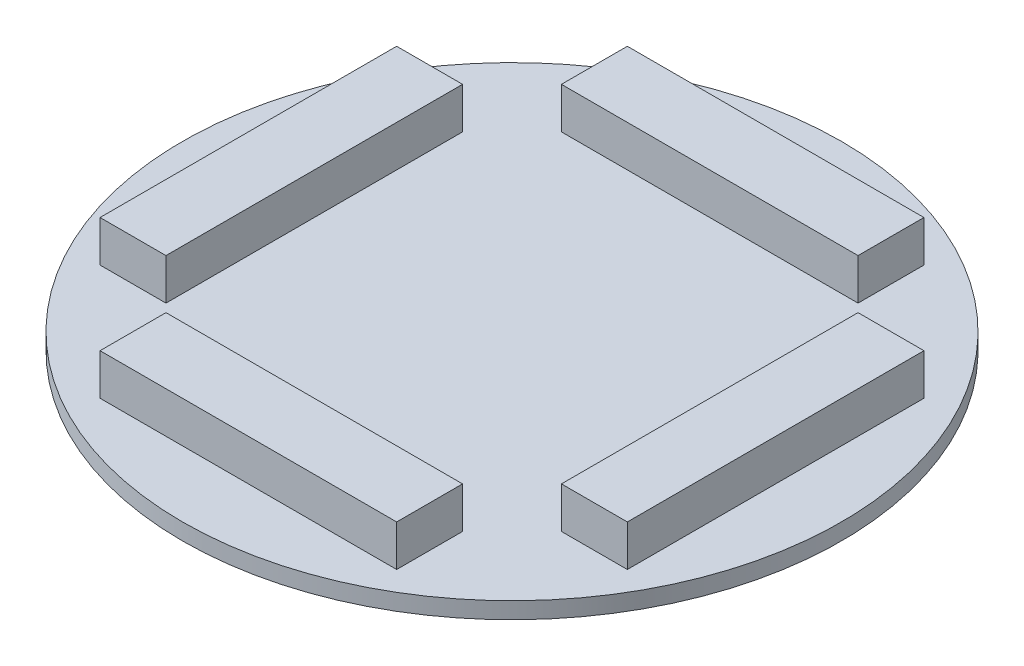
ISO-10303-21;
HEADER;
FILE_DESCRIPTION(('STEP AP214'),'2;1');
FILE_NAME('part.step','',(''),(''),'','','');
FILE_SCHEMA(('AUTOMOTIVE_DESIGN { 1 0 10303 214 1 1 1 1 }'));
ENDSEC;
DATA;
#1=APPLICATION_CONTEXT('core data for automotive mechanical design processes');
#2=APPLICATION_PROTOCOL_DEFINITION('international standard','automotive_design',2000,#1);
#3=PRODUCT_CONTEXT('',#1,'mechanical');
#4=PRODUCT('Part','Part','',(#3));
#5=PRODUCT_RELATED_PRODUCT_CATEGORY('part','',(#4));
#6=PRODUCT_DEFINITION_FORMATION('','',#4);
#7=PRODUCT_DEFINITION_CONTEXT('part definition',#1,'design');
#8=PRODUCT_DEFINITION('design','',#6,#7);
#9=PRODUCT_DEFINITION_SHAPE('','',#8);
#10=(LENGTH_UNIT() NAMED_UNIT(*) SI_UNIT(.MILLI.,.METRE.));
#11=(NAMED_UNIT(*) PLANE_ANGLE_UNIT() SI_UNIT($,.RADIAN.));
#12=(NAMED_UNIT(*) SI_UNIT($,.STERADIAN.) SOLID_ANGLE_UNIT());
#13=UNCERTAINTY_MEASURE_WITH_UNIT(LENGTH_MEASURE(1.E-05),#10,'distance_accuracy_value','');
#14=(GEOMETRIC_REPRESENTATION_CONTEXT(3) GLOBAL_UNCERTAINTY_ASSIGNED_CONTEXT((#13)) GLOBAL_UNIT_ASSIGNED_CONTEXT((#10,
#11,#12)) REPRESENTATION_CONTEXT('',''));
#15=CARTESIAN_POINT('',(0.,0.,0.));
#16=DIRECTION('',(0.,0.,1.));
#17=DIRECTION('',(1.,0.,0.));
#18=AXIS2_PLACEMENT_3D('',#15,#16,#17);
#19=CARTESIAN_POINT('',(0.,1.,0.));
#20=DIRECTION('',(0.,1.,0.));
#21=DIRECTION('',(0.,0.,1.));
#22=AXIS2_PLACEMENT_3D('',#19,#20,#21);
#23=PLANE('',#22);
#24=CARTESIAN_POINT('',(0.,1.,0.));
#25=DIRECTION('',(0.,1.,0.));
#26=DIRECTION('',(0.,0.,1.));
#27=AXIS2_PLACEMENT_3D('',#24,#25,#26);
#28=CIRCLE('',#27,20.);
#29=CARTESIAN_POINT('',(0.,1.,20.));
#30=VERTEX_POINT('',#29);
#31=EDGE_CURVE('E11',#30,#30,#28,.T.);
#32=ORIENTED_EDGE('',*,*,#31,.T.);
#33=EDGE_LOOP('',(#32));
#34=FACE_BOUND('',#33,.T.);
#35=DIRECTION('',(1.,0.,0.));
#36=VECTOR('',#35,1.);
#37=CARTESIAN_POINT('',(-9.,1.,-12.));
#38=LINE('',#37,#36);
#39=CARTESIAN_POINT('',(-9.,1.,-12.));
#40=VERTEX_POINT('',#39);
#41=CARTESIAN_POINT('',(9.,1.,-12.));
#42=VERTEX_POINT('',#41);
#43=EDGE_CURVE('E257',#40,#42,#38,.T.);
#44=ORIENTED_EDGE('',*,*,#43,.F.);
#45=DIRECTION('',(0.,0.,1.));
#46=VECTOR('',#45,1.);
#47=CARTESIAN_POINT('',(-9.,1.,-16.));
#48=LINE('',#47,#46);
#49=CARTESIAN_POINT('',(-9.,1.,-16.));
#50=VERTEX_POINT('',#49);
#51=EDGE_CURVE('E241',#50,#40,#48,.T.);
#52=ORIENTED_EDGE('',*,*,#51,.F.);
#53=DIRECTION('',(1.,0.,0.));
#54=VECTOR('',#53,1.);
#55=CARTESIAN_POINT('',(-9.,1.,-16.));
#56=LINE('',#55,#54);
#57=CARTESIAN_POINT('',(9.,1.,-16.));
#58=VERTEX_POINT('',#57);
#59=EDGE_CURVE('E246',#50,#58,#56,.T.);
#60=ORIENTED_EDGE('',*,*,#59,.T.);
#61=DIRECTION('',(0.,0.,1.));
#62=VECTOR('',#61,1.);
#63=CARTESIAN_POINT('',(9.,1.,-16.));
#64=LINE('',#63,#62);
#65=EDGE_CURVE('E260',#58,#42,#64,.T.);
#66=ORIENTED_EDGE('',*,*,#65,.T.);
#67=EDGE_LOOP('',(#44,#52,#60,#66));
#68=FACE_BOUND('',#67,.T.);
#69=DIRECTION('',(0.,0.,-1.));
#70=VECTOR('',#69,1.);
#71=CARTESIAN_POINT('',(-12.,1.,9.00000000000004));
#72=LINE('',#71,#70);
#73=CARTESIAN_POINT('',(-12.,1.,9.00000000000004));
#74=VERTEX_POINT('',#73);
#75=CARTESIAN_POINT('',(-12.,1.,-8.99999999999996));
#76=VERTEX_POINT('',#75);
#77=EDGE_CURVE('E224',#74,#76,#72,.T.);
#78=ORIENTED_EDGE('',*,*,#77,.F.);
#79=DIRECTION('',(1.,0.,0.));
#80=VECTOR('',#79,1.);
#81=CARTESIAN_POINT('',(-16.,1.,9.00000000000006));
#82=LINE('',#81,#80);
#83=CARTESIAN_POINT('',(-16.,1.,9.00000000000006));
#84=VERTEX_POINT('',#83);
#85=EDGE_CURVE('E208',#84,#74,#82,.T.);
#86=ORIENTED_EDGE('',*,*,#85,.F.);
#87=DIRECTION('',(0.,0.,-1.));
#88=VECTOR('',#87,1.);
#89=CARTESIAN_POINT('',(-16.,1.,9.00000000000006));
#90=LINE('',#89,#88);
#91=CARTESIAN_POINT('',(-16.,1.,-8.99999999999994));
#92=VERTEX_POINT('',#91);
#93=EDGE_CURVE('E213',#84,#92,#90,.T.);
#94=ORIENTED_EDGE('',*,*,#93,.T.);
#95=DIRECTION('',(1.,0.,0.));
#96=VECTOR('',#95,1.);
#97=CARTESIAN_POINT('',(-16.,1.,-8.99999999999994));
#98=LINE('',#97,#96);
#99=EDGE_CURVE('E227',#92,#76,#98,.T.);
#100=ORIENTED_EDGE('',*,*,#99,.T.);
#101=EDGE_LOOP('',(#78,#86,#94,#100));
#102=FACE_BOUND('',#101,.T.);
#103=DIRECTION('',(-1.,0.,0.));
#104=VECTOR('',#103,1.);
#105=CARTESIAN_POINT('',(9.,1.,12.));
#106=LINE('',#105,#104);
#107=CARTESIAN_POINT('',(9.,1.,12.));
#108=VERTEX_POINT('',#107);
#109=CARTESIAN_POINT('',(-9.,1.,12.));
#110=VERTEX_POINT('',#109);
#111=EDGE_CURVE('E173',#108,#110,#106,.T.);
#112=ORIENTED_EDGE('',*,*,#111,.F.);
#113=DIRECTION('',(0.,0.,-1.));
#114=VECTOR('',#113,1.);
#115=CARTESIAN_POINT('',(9.,1.,16.));
#116=LINE('',#115,#114);
#117=CARTESIAN_POINT('',(9.,1.,16.));
#118=VERTEX_POINT('',#117);
#119=EDGE_CURVE('E170',#118,#108,#116,.T.);
#120=ORIENTED_EDGE('',*,*,#119,.F.);
#121=DIRECTION('',(-1.,0.,0.));
#122=VECTOR('',#121,1.);
#123=CARTESIAN_POINT('',(9.,1.,16.));
#124=LINE('',#123,#122);
#125=CARTESIAN_POINT('',(-9.,1.,16.));
#126=VERTEX_POINT('',#125);
#127=EDGE_CURVE('E183',#118,#126,#124,.T.);
#128=ORIENTED_EDGE('',*,*,#127,.T.);
#129=DIRECTION('',(0.,0.,-1.));
#130=VECTOR('',#129,1.);
#131=CARTESIAN_POINT('',(-9.,1.,16.));
#132=LINE('',#131,#130);
#133=EDGE_CURVE('E194',#126,#110,#132,.T.);
#134=ORIENTED_EDGE('',*,*,#133,.T.);
#135=EDGE_LOOP('',(#112,#120,#128,#134));
#136=FACE_BOUND('',#135,.T.);
#137=DIRECTION('',(0.,0.,1.));
#138=VECTOR('',#137,1.);
#139=CARTESIAN_POINT('',(11.9999999999999,1.,-9.00000000000012));
#140=LINE('',#139,#138);
#141=CARTESIAN_POINT('',(11.9999999999999,1.,-9.00000000000012));
#142=VERTEX_POINT('',#141);
#143=CARTESIAN_POINT('',(12.0000000000001,1.,8.99999999999988));
#144=VERTEX_POINT('',#143);
#145=EDGE_CURVE('E50',#142,#144,#140,.T.);
#146=ORIENTED_EDGE('',*,*,#145,.F.);
#147=DIRECTION('',(-1.,0.,0.));
#148=VECTOR('',#147,1.);
#149=CARTESIAN_POINT('',(15.9999999999999,1.,-9.00000000000017));
#150=LINE('',#149,#148);
#151=CARTESIAN_POINT('',(15.9999999999999,1.,-9.00000000000017));
#152=VERTEX_POINT('',#151);
#153=EDGE_CURVE('E169',#152,#142,#150,.T.);
#154=ORIENTED_EDGE('',*,*,#153,.F.);
#155=DIRECTION('',(0.,0.,1.));
#156=VECTOR('',#155,1.);
#157=CARTESIAN_POINT('',(15.9999999999999,1.,-9.00000000000017));
#158=LINE('',#157,#156);
#159=CARTESIAN_POINT('',(16.0000000000001,1.,8.99999999999983));
#160=VERTEX_POINT('',#159);
#161=EDGE_CURVE('E166',#152,#160,#158,.T.);
#162=ORIENTED_EDGE('',*,*,#161,.T.);
#163=DIRECTION('',(-1.,0.,0.));
#164=VECTOR('',#163,1.);
#165=CARTESIAN_POINT('',(16.0000000000001,1.,8.99999999999983));
#166=LINE('',#165,#164);
#167=EDGE_CURVE('E55',#160,#144,#166,.T.);
#168=ORIENTED_EDGE('',*,*,#167,.T.);
#169=EDGE_LOOP('',(#146,#154,#162,#168));
#170=FACE_BOUND('',#169,.T.);
#171=ADVANCED_FACE('F35',(#34,#68,#102,#136,#170),#23,.T.);
#172=CARTESIAN_POINT('',(0.,1.,0.));
#173=DIRECTION('',(0.,-1.,0.));
#174=DIRECTION('',(0.,0.,-1.));
#175=AXIS2_PLACEMENT_3D('',#172,#173,#174);
#176=CYLINDRICAL_SURFACE('',#175,20.);
#177=ORIENTED_EDGE('',*,*,#31,.F.);
#178=EDGE_LOOP('',(#177));
#179=FACE_BOUND('',#178,.T.);
#180=CARTESIAN_POINT('',(0.,0.,0.));
#181=DIRECTION('',(0.,1.,0.));
#182=DIRECTION('',(0.,0.,1.));
#183=AXIS2_PLACEMENT_3D('',#180,#181,#182);
#184=CIRCLE('',#183,20.);
#185=CARTESIAN_POINT('',(0.,0.,20.));
#186=VERTEX_POINT('',#185);
#187=EDGE_CURVE('E39',#186,#186,#184,.T.);
#188=ORIENTED_EDGE('',*,*,#187,.T.);
#189=EDGE_LOOP('',(#188));
#190=FACE_BOUND('',#189,.T.);
#191=ADVANCED_FACE('F37',(#179,#190),#176,.T.);
#192=CARTESIAN_POINT('',(0.,0.,0.));
#193=DIRECTION('',(0.,1.,0.));
#194=DIRECTION('',(0.,0.,1.));
#195=AXIS2_PLACEMENT_3D('',#192,#193,#194);
#196=PLANE('',#195);
#197=ORIENTED_EDGE('',*,*,#187,.F.);
#198=EDGE_LOOP('',(#197));
#199=FACE_BOUND('',#198,.T.);
#200=ADVANCED_FACE('F279',(#199),#196,.F.);
#201=CARTESIAN_POINT('',(-9.,3.5,-16.));
#202=DIRECTION('',(1.,0.,0.));
#203=DIRECTION('',(0.,0.,-1.));
#204=AXIS2_PLACEMENT_3D('',#201,#202,#203);
#205=PLANE('',#204);
#206=ORIENTED_EDGE('',*,*,#51,.T.);
#207=DIRECTION('',(0.,-1.,0.));
#208=VECTOR('',#207,1.);
#209=CARTESIAN_POINT('',(-9.,3.5,-12.));
#210=LINE('',#209,#208);
#211=CARTESIAN_POINT('',(-9.,3.5,-12.));
#212=VERTEX_POINT('',#211);
#213=EDGE_CURVE('E271',#212,#40,#210,.T.);
#214=ORIENTED_EDGE('',*,*,#213,.F.);
#215=DIRECTION('',(0.,0.,1.));
#216=VECTOR('',#215,1.);
#217=CARTESIAN_POINT('',(-9.,3.5,-16.));
#218=LINE('',#217,#216);
#219=CARTESIAN_POINT('',(-9.,3.5,-16.));
#220=VERTEX_POINT('',#219);
#221=EDGE_CURVE('E242',#220,#212,#218,.T.);
#222=ORIENTED_EDGE('',*,*,#221,.F.);
#223=DIRECTION('',(0.,-1.,0.));
#224=VECTOR('',#223,1.);
#225=CARTESIAN_POINT('',(-9.,3.5,-16.));
#226=LINE('',#225,#224);
#227=EDGE_CURVE('E254',#220,#50,#226,.T.);
#228=ORIENTED_EDGE('',*,*,#227,.T.);
#229=EDGE_LOOP('',(#206,#214,#222,#228));
#230=FACE_BOUND('',#229,.T.);
#231=ADVANCED_FACE('F281',(#230),#205,.F.);
#232=CARTESIAN_POINT('',(-9.,3.5,-12.));
#233=DIRECTION('',(0.,0.,-1.));
#234=DIRECTION('',(-1.,0.,0.));
#235=AXIS2_PLACEMENT_3D('',#232,#233,#234);
#236=PLANE('',#235);
#237=ORIENTED_EDGE('',*,*,#43,.T.);
#238=DIRECTION('',(0.,-1.,0.));
#239=VECTOR('',#238,1.);
#240=CARTESIAN_POINT('',(9.,3.5,-12.));
#241=LINE('',#240,#239);
#242=CARTESIAN_POINT('',(9.,3.5,-12.));
#243=VERTEX_POINT('',#242);
#244=EDGE_CURVE('E268',#243,#42,#241,.T.);
#245=ORIENTED_EDGE('',*,*,#244,.F.);
#246=DIRECTION('',(1.,0.,0.));
#247=VECTOR('',#246,1.);
#248=CARTESIAN_POINT('',(-9.,3.5,-12.));
#249=LINE('',#248,#247);
#250=EDGE_CURVE('E245',#212,#243,#249,.T.);
#251=ORIENTED_EDGE('',*,*,#250,.F.);
#252=ORIENTED_EDGE('',*,*,#213,.T.);
#253=EDGE_LOOP('',(#237,#245,#251,#252));
#254=FACE_BOUND('',#253,.T.);
#255=ADVANCED_FACE('F286',(#254),#236,.F.);
#256=CARTESIAN_POINT('',(9.,3.5,-16.));
#257=DIRECTION('',(1.,0.,0.));
#258=DIRECTION('',(0.,0.,-1.));
#259=AXIS2_PLACEMENT_3D('',#256,#257,#258);
#260=PLANE('',#259);
#261=ORIENTED_EDGE('',*,*,#65,.F.);
#262=DIRECTION('',(0.,-1.,0.));
#263=VECTOR('',#262,1.);
#264=CARTESIAN_POINT('',(9.,3.5,-16.));
#265=LINE('',#264,#263);
#266=CARTESIAN_POINT('',(9.,3.5,-16.));
#267=VERTEX_POINT('',#266);
#268=EDGE_CURVE('E265',#267,#58,#265,.T.);
#269=ORIENTED_EDGE('',*,*,#268,.F.);
#270=DIRECTION('',(0.,0.,1.));
#271=VECTOR('',#270,1.);
#272=CARTESIAN_POINT('',(9.,3.5,-16.));
#273=LINE('',#272,#271);
#274=EDGE_CURVE('E248',#267,#243,#273,.T.);
#275=ORIENTED_EDGE('',*,*,#274,.T.);
#276=ORIENTED_EDGE('',*,*,#244,.T.);
#277=EDGE_LOOP('',(#261,#269,#275,#276));
#278=FACE_BOUND('',#277,.T.);
#279=ADVANCED_FACE('F299',(#278),#260,.T.);
#280=CARTESIAN_POINT('',(-9.,3.5,-16.));
#281=DIRECTION('',(0.,0.,-1.));
#282=DIRECTION('',(-1.,0.,0.));
#283=AXIS2_PLACEMENT_3D('',#280,#281,#282);
#284=PLANE('',#283);
#285=ORIENTED_EDGE('',*,*,#59,.F.);
#286=ORIENTED_EDGE('',*,*,#227,.F.);
#287=DIRECTION('',(1.,0.,0.));
#288=VECTOR('',#287,1.);
#289=CARTESIAN_POINT('',(-9.,3.5,-16.));
#290=LINE('',#289,#288);
#291=EDGE_CURVE('E251',#220,#267,#290,.T.);
#292=ORIENTED_EDGE('',*,*,#291,.T.);
#293=ORIENTED_EDGE('',*,*,#268,.T.);
#294=EDGE_LOOP('',(#285,#286,#292,#293));
#295=FACE_BOUND('',#294,.T.);
#296=ADVANCED_FACE('F302',(#295),#284,.T.);
#297=CARTESIAN_POINT('',(0.,3.5,0.));
#298=DIRECTION('',(0.,1.,0.));
#299=DIRECTION('',(0.,0.,1.));
#300=AXIS2_PLACEMENT_3D('',#297,#298,#299);
#301=PLANE('',#300);
#302=ORIENTED_EDGE('',*,*,#221,.T.);
#303=ORIENTED_EDGE('',*,*,#250,.T.);
#304=ORIENTED_EDGE('',*,*,#274,.F.);
#305=ORIENTED_EDGE('',*,*,#291,.F.);
#306=EDGE_LOOP('',(#302,#303,#304,#305));
#307=FACE_BOUND('',#306,.T.);
#308=ADVANCED_FACE('F306',(#307),#301,.T.);
#309=CARTESIAN_POINT('',(-16.,3.5,9.00000000000006));
#310=DIRECTION('',(0.,0.,-1.));
#311=DIRECTION('',(-1.,0.,0.));
#312=AXIS2_PLACEMENT_3D('',#309,#310,#311);
#313=PLANE('',#312);
#314=ORIENTED_EDGE('',*,*,#85,.T.);
#315=DIRECTION('',(0.,-1.,0.));
#316=VECTOR('',#315,1.);
#317=CARTESIAN_POINT('',(-12.,3.5,9.00000000000004));
#318=LINE('',#317,#316);
#319=CARTESIAN_POINT('',(-12.,3.5,9.00000000000004));
#320=VERTEX_POINT('',#319);
#321=EDGE_CURVE('E238',#320,#74,#318,.T.);
#322=ORIENTED_EDGE('',*,*,#321,.F.);
#323=DIRECTION('',(1.,0.,0.));
#324=VECTOR('',#323,1.);
#325=CARTESIAN_POINT('',(-16.,3.5,9.00000000000006));
#326=LINE('',#325,#324);
#327=CARTESIAN_POINT('',(-16.,3.5,9.00000000000006));
#328=VERTEX_POINT('',#327);
#329=EDGE_CURVE('E209',#328,#320,#326,.T.);
#330=ORIENTED_EDGE('',*,*,#329,.F.);
#331=DIRECTION('',(0.,-1.,0.));
#332=VECTOR('',#331,1.);
#333=CARTESIAN_POINT('',(-16.,3.5,9.00000000000006));
#334=LINE('',#333,#332);
#335=EDGE_CURVE('E221',#328,#84,#334,.T.);
#336=ORIENTED_EDGE('',*,*,#335,.T.);
#337=EDGE_LOOP('',(#314,#322,#330,#336));
#338=FACE_BOUND('',#337,.T.);
#339=ADVANCED_FACE('F310',(#338),#313,.F.);
#340=CARTESIAN_POINT('',(-12.,3.5,9.00000000000004));
#341=DIRECTION('',(-1.,0.,0.));
#342=DIRECTION('',(0.,0.,1.));
#343=AXIS2_PLACEMENT_3D('',#340,#341,#342);
#344=PLANE('',#343);
#345=ORIENTED_EDGE('',*,*,#77,.T.);
#346=DIRECTION('',(0.,-1.,0.));
#347=VECTOR('',#346,1.);
#348=CARTESIAN_POINT('',(-12.,3.5,-8.99999999999996));
#349=LINE('',#348,#347);
#350=CARTESIAN_POINT('',(-12.,3.5,-8.99999999999996));
#351=VERTEX_POINT('',#350);
#352=EDGE_CURVE('E235',#351,#76,#349,.T.);
#353=ORIENTED_EDGE('',*,*,#352,.F.);
#354=DIRECTION('',(0.,0.,-1.));
#355=VECTOR('',#354,1.);
#356=CARTESIAN_POINT('',(-12.,3.5,9.00000000000004));
#357=LINE('',#356,#355);
#358=EDGE_CURVE('E212',#320,#351,#357,.T.);
#359=ORIENTED_EDGE('',*,*,#358,.F.);
#360=ORIENTED_EDGE('',*,*,#321,.T.);
#361=EDGE_LOOP('',(#345,#353,#359,#360));
#362=FACE_BOUND('',#361,.T.);
#363=ADVANCED_FACE('F314',(#362),#344,.F.);
#364=CARTESIAN_POINT('',(-16.,3.5,-8.99999999999994));
#365=DIRECTION('',(0.,0.,-1.));
#366=DIRECTION('',(-1.,0.,0.));
#367=AXIS2_PLACEMENT_3D('',#364,#365,#366);
#368=PLANE('',#367);
#369=ORIENTED_EDGE('',*,*,#99,.F.);
#370=DIRECTION('',(0.,-1.,0.));
#371=VECTOR('',#370,1.);
#372=CARTESIAN_POINT('',(-16.,3.5,-8.99999999999994));
#373=LINE('',#372,#371);
#374=CARTESIAN_POINT('',(-16.,3.5,-8.99999999999994));
#375=VERTEX_POINT('',#374);
#376=EDGE_CURVE('E232',#375,#92,#373,.T.);
#377=ORIENTED_EDGE('',*,*,#376,.F.);
#378=DIRECTION('',(1.,0.,0.));
#379=VECTOR('',#378,1.);
#380=CARTESIAN_POINT('',(-16.,3.5,-8.99999999999994));
#381=LINE('',#380,#379);
#382=EDGE_CURVE('E215',#375,#351,#381,.T.);
#383=ORIENTED_EDGE('',*,*,#382,.T.);
#384=ORIENTED_EDGE('',*,*,#352,.T.);
#385=EDGE_LOOP('',(#369,#377,#383,#384));
#386=FACE_BOUND('',#385,.T.);
#387=ADVANCED_FACE('F318',(#386),#368,.T.);
#388=CARTESIAN_POINT('',(-16.,3.5,9.00000000000006));
#389=DIRECTION('',(-1.,0.,0.));
#390=DIRECTION('',(0.,0.,1.));
#391=AXIS2_PLACEMENT_3D('',#388,#389,#390);
#392=PLANE('',#391);
#393=ORIENTED_EDGE('',*,*,#93,.F.);
#394=ORIENTED_EDGE('',*,*,#335,.F.);
#395=DIRECTION('',(0.,0.,-1.));
#396=VECTOR('',#395,1.);
#397=CARTESIAN_POINT('',(-16.,3.5,9.00000000000006));
#398=LINE('',#397,#396);
#399=EDGE_CURVE('E218',#328,#375,#398,.T.);
#400=ORIENTED_EDGE('',*,*,#399,.T.);
#401=ORIENTED_EDGE('',*,*,#376,.T.);
#402=EDGE_LOOP('',(#393,#394,#400,#401));
#403=FACE_BOUND('',#402,.T.);
#404=ADVANCED_FACE('F322',(#403),#392,.T.);
#405=CARTESIAN_POINT('',(0.,3.5,0.));
#406=DIRECTION('',(0.,1.,0.));
#407=DIRECTION('',(1.,0.,0.));
#408=AXIS2_PLACEMENT_3D('',#405,#406,#407);
#409=PLANE('',#408);
#410=ORIENTED_EDGE('',*,*,#329,.T.);
#411=ORIENTED_EDGE('',*,*,#358,.T.);
#412=ORIENTED_EDGE('',*,*,#382,.F.);
#413=ORIENTED_EDGE('',*,*,#399,.F.);
#414=EDGE_LOOP('',(#410,#411,#412,#413));
#415=FACE_BOUND('',#414,.T.);
#416=ADVANCED_FACE('F326',(#415),#409,.T.);
#417=CARTESIAN_POINT('',(9.,3.5,16.));
#418=DIRECTION('',(-1.,0.,0.));
#419=DIRECTION('',(0.,0.,1.));
#420=AXIS2_PLACEMENT_3D('',#417,#418,#419);
#421=PLANE('',#420);
#422=ORIENTED_EDGE('',*,*,#119,.T.);
#423=DIRECTION('',(0.,-1.,0.));
#424=VECTOR('',#423,1.);
#425=CARTESIAN_POINT('',(9.,3.5,12.));
#426=LINE('',#425,#424);
#427=CARTESIAN_POINT('',(9.,3.5,12.));
#428=VERTEX_POINT('',#427);
#429=EDGE_CURVE('E205',#428,#108,#426,.T.);
#430=ORIENTED_EDGE('',*,*,#429,.F.);
#431=DIRECTION('',(0.,0.,-1.));
#432=VECTOR('',#431,1.);
#433=CARTESIAN_POINT('',(9.,3.5,16.));
#434=LINE('',#433,#432);
#435=CARTESIAN_POINT('',(9.,3.5,16.));
#436=VERTEX_POINT('',#435);
#437=EDGE_CURVE('E179',#436,#428,#434,.T.);
#438=ORIENTED_EDGE('',*,*,#437,.F.);
#439=DIRECTION('',(0.,-1.,0.));
#440=VECTOR('',#439,1.);
#441=CARTESIAN_POINT('',(9.,3.5,16.));
#442=LINE('',#441,#440);
#443=EDGE_CURVE('E190',#436,#118,#442,.T.);
#444=ORIENTED_EDGE('',*,*,#443,.T.);
#445=EDGE_LOOP('',(#422,#430,#438,#444));
#446=FACE_BOUND('',#445,.T.);
#447=ADVANCED_FACE('F330',(#446),#421,.F.);
#448=CARTESIAN_POINT('',(9.,3.5,12.));
#449=DIRECTION('',(0.,0.,1.));
#450=DIRECTION('',(1.,0.,0.));
#451=AXIS2_PLACEMENT_3D('',#448,#449,#450);
#452=PLANE('',#451);
#453=ORIENTED_EDGE('',*,*,#111,.T.);
#454=DIRECTION('',(0.,-1.,0.));
#455=VECTOR('',#454,1.);
#456=CARTESIAN_POINT('',(-9.,3.5,12.));
#457=LINE('',#456,#455);
#458=CARTESIAN_POINT('',(-9.,3.5,12.));
#459=VERTEX_POINT('',#458);
#460=EDGE_CURVE('E202',#459,#110,#457,.T.);
#461=ORIENTED_EDGE('',*,*,#460,.F.);
#462=DIRECTION('',(-1.,0.,0.));
#463=VECTOR('',#462,1.);
#464=CARTESIAN_POINT('',(9.,3.5,12.));
#465=LINE('',#464,#463);
#466=EDGE_CURVE('E182',#428,#459,#465,.T.);
#467=ORIENTED_EDGE('',*,*,#466,.F.);
#468=ORIENTED_EDGE('',*,*,#429,.T.);
#469=EDGE_LOOP('',(#453,#461,#467,#468));
#470=FACE_BOUND('',#469,.T.);
#471=ADVANCED_FACE('F334',(#470),#452,.F.);
#472=CARTESIAN_POINT('',(-9.,3.5,16.));
#473=DIRECTION('',(-1.,0.,0.));
#474=DIRECTION('',(0.,0.,1.));
#475=AXIS2_PLACEMENT_3D('',#472,#473,#474);
#476=PLANE('',#475);
#477=ORIENTED_EDGE('',*,*,#133,.F.);
#478=DIRECTION('',(0.,-1.,0.));
#479=VECTOR('',#478,1.);
#480=CARTESIAN_POINT('',(-9.,3.5,16.));
#481=LINE('',#480,#479);
#482=CARTESIAN_POINT('',(-9.,3.5,16.));
#483=VERTEX_POINT('',#482);
#484=EDGE_CURVE('E199',#483,#126,#481,.T.);
#485=ORIENTED_EDGE('',*,*,#484,.F.);
#486=DIRECTION('',(0.,0.,-1.));
#487=VECTOR('',#486,1.);
#488=CARTESIAN_POINT('',(-9.,3.5,16.));
#489=LINE('',#488,#487);
#490=EDGE_CURVE('E185',#483,#459,#489,.T.);
#491=ORIENTED_EDGE('',*,*,#490,.T.);
#492=ORIENTED_EDGE('',*,*,#460,.T.);
#493=EDGE_LOOP('',(#477,#485,#491,#492));
#494=FACE_BOUND('',#493,.T.);
#495=ADVANCED_FACE('F338',(#494),#476,.T.);
#496=CARTESIAN_POINT('',(9.,3.5,16.));
#497=DIRECTION('',(0.,0.,1.));
#498=DIRECTION('',(1.,0.,0.));
#499=AXIS2_PLACEMENT_3D('',#496,#497,#498);
#500=PLANE('',#499);
#501=ORIENTED_EDGE('',*,*,#127,.F.);
#502=ORIENTED_EDGE('',*,*,#443,.F.);
#503=DIRECTION('',(-1.,0.,0.));
#504=VECTOR('',#503,1.);
#505=CARTESIAN_POINT('',(9.,3.5,16.));
#506=LINE('',#505,#504);
#507=EDGE_CURVE('E188',#436,#483,#506,.T.);
#508=ORIENTED_EDGE('',*,*,#507,.T.);
#509=ORIENTED_EDGE('',*,*,#484,.T.);
#510=EDGE_LOOP('',(#501,#502,#508,#509));
#511=FACE_BOUND('',#510,.T.);
#512=ADVANCED_FACE('F342',(#511),#500,.T.);
#513=CARTESIAN_POINT('',(0.,3.5,0.));
#514=DIRECTION('',(0.,1.,0.));
#515=DIRECTION('',(0.,0.,-1.));
#516=AXIS2_PLACEMENT_3D('',#513,#514,#515);
#517=PLANE('',#516);
#518=ORIENTED_EDGE('',*,*,#437,.T.);
#519=ORIENTED_EDGE('',*,*,#466,.T.);
#520=ORIENTED_EDGE('',*,*,#490,.F.);
#521=ORIENTED_EDGE('',*,*,#507,.F.);
#522=EDGE_LOOP('',(#518,#519,#520,#521));
#523=FACE_BOUND('',#522,.T.);
#524=ADVANCED_FACE('F346',(#523),#517,.T.);
#525=CARTESIAN_POINT('',(15.9999999999999,3.5,-9.00000000000017));
#526=DIRECTION('',(0.,0.,1.));
#527=DIRECTION('',(1.,0.,0.));
#528=AXIS2_PLACEMENT_3D('',#525,#526,#527);
#529=PLANE('',#528);
#530=ORIENTED_EDGE('',*,*,#153,.T.);
#531=DIRECTION('',(0.,-1.,0.));
#532=VECTOR('',#531,1.);
#533=CARTESIAN_POINT('',(11.9999999999999,3.5,-9.00000000000012));
#534=LINE('',#533,#532);
#535=CARTESIAN_POINT('',(11.9999999999999,3.5,-9.00000000000012));
#536=VERTEX_POINT('',#535);
#537=EDGE_CURVE('E150',#536,#142,#534,.T.);
#538=ORIENTED_EDGE('',*,*,#537,.F.);
#539=DIRECTION('',(-1.,0.,0.));
#540=VECTOR('',#539,1.);
#541=CARTESIAN_POINT('',(15.9999999999999,3.5,-9.00000000000017));
#542=LINE('',#541,#540);
#543=CARTESIAN_POINT('',(15.9999999999999,3.5,-9.00000000000017));
#544=VERTEX_POINT('',#543);
#545=EDGE_CURVE('E157',#544,#536,#542,.T.);
#546=ORIENTED_EDGE('',*,*,#545,.F.);
#547=DIRECTION('',(0.,-1.,0.));
#548=VECTOR('',#547,1.);
#549=CARTESIAN_POINT('',(15.9999999999999,3.5,-9.00000000000017));
#550=LINE('',#549,#548);
#551=EDGE_CURVE('E530',#544,#152,#550,.T.);
#552=ORIENTED_EDGE('',*,*,#551,.T.);
#553=EDGE_LOOP('',(#530,#538,#546,#552));
#554=FACE_BOUND('',#553,.T.);
#555=ADVANCED_FACE('F168',(#554),#529,.F.);
#556=CARTESIAN_POINT('',(11.9999999999999,3.5,-9.00000000000012));
#557=DIRECTION('',(1.,0.,0.));
#558=DIRECTION('',(0.,0.,-1.));
#559=AXIS2_PLACEMENT_3D('',#556,#557,#558);
#560=PLANE('',#559);
#561=ORIENTED_EDGE('',*,*,#145,.T.);
#562=DIRECTION('',(0.,-1.,0.));
#563=VECTOR('',#562,1.);
#564=CARTESIAN_POINT('',(12.0000000000001,3.5,8.99999999999988));
#565=LINE('',#564,#563);
#566=CARTESIAN_POINT('',(12.0000000000001,3.5,8.99999999999988));
#567=VERTEX_POINT('',#566);
#568=EDGE_CURVE('E152',#567,#144,#565,.T.);
#569=ORIENTED_EDGE('',*,*,#568,.F.);
#570=DIRECTION('',(0.,0.,1.));
#571=VECTOR('',#570,1.);
#572=CARTESIAN_POINT('',(11.9999999999999,3.5,-9.00000000000012));
#573=LINE('',#572,#571);
#574=EDGE_CURVE('E146',#536,#567,#573,.T.);
#575=ORIENTED_EDGE('',*,*,#574,.F.);
#576=ORIENTED_EDGE('',*,*,#537,.T.);
#577=EDGE_LOOP('',(#561,#569,#575,#576));
#578=FACE_BOUND('',#577,.T.);
#579=ADVANCED_FACE('F148',(#578),#560,.F.);
#580=CARTESIAN_POINT('',(16.0000000000001,3.5,8.99999999999983));
#581=DIRECTION('',(0.,0.,1.));
#582=DIRECTION('',(1.,0.,0.));
#583=AXIS2_PLACEMENT_3D('',#580,#581,#582);
#584=PLANE('',#583);
#585=ORIENTED_EDGE('',*,*,#167,.F.);
#586=DIRECTION('',(0.,-1.,0.));
#587=VECTOR('',#586,1.);
#588=CARTESIAN_POINT('',(16.0000000000001,3.5,8.99999999999983));
#589=LINE('',#588,#587);
#590=CARTESIAN_POINT('',(16.0000000000001,3.5,8.99999999999983));
#591=VERTEX_POINT('',#590);
#592=EDGE_CURVE('E175',#591,#160,#589,.T.);
#593=ORIENTED_EDGE('',*,*,#592,.F.);
#594=DIRECTION('',(-1.,0.,0.));
#595=VECTOR('',#594,1.);
#596=CARTESIAN_POINT('',(16.0000000000001,3.5,8.99999999999983));
#597=LINE('',#596,#595);
#598=EDGE_CURVE('E156',#591,#567,#597,.T.);
#599=ORIENTED_EDGE('',*,*,#598,.T.);
#600=ORIENTED_EDGE('',*,*,#568,.T.);
#601=EDGE_LOOP('',(#585,#593,#599,#600));
#602=FACE_BOUND('',#601,.T.);
#603=ADVANCED_FACE('F355',(#602),#584,.T.);
#604=CARTESIAN_POINT('',(15.9999999999999,3.5,-9.00000000000017));
#605=DIRECTION('',(1.,0.,0.));
#606=DIRECTION('',(0.,0.,-1.));
#607=AXIS2_PLACEMENT_3D('',#604,#605,#606);
#608=PLANE('',#607);
#609=ORIENTED_EDGE('',*,*,#161,.F.);
#610=ORIENTED_EDGE('',*,*,#551,.F.);
#611=DIRECTION('',(0.,0.,1.));
#612=VECTOR('',#611,1.);
#613=CARTESIAN_POINT('',(15.9999999999999,3.5,-9.00000000000017));
#614=LINE('',#613,#612);
#615=EDGE_CURVE('E163',#544,#591,#614,.T.);
#616=ORIENTED_EDGE('',*,*,#615,.T.);
#617=ORIENTED_EDGE('',*,*,#592,.T.);
#618=EDGE_LOOP('',(#609,#610,#616,#617));
#619=FACE_BOUND('',#618,.T.);
#620=ADVANCED_FACE('F358',(#619),#608,.T.);
#621=CARTESIAN_POINT('',(0.,3.5,0.));
#622=DIRECTION('',(0.,1.,0.));
#623=DIRECTION('',(-1.,0.,0.));
#624=AXIS2_PLACEMENT_3D('',#621,#622,#623);
#625=PLANE('',#624);
#626=ORIENTED_EDGE('',*,*,#545,.T.);
#627=ORIENTED_EDGE('',*,*,#574,.T.);
#628=ORIENTED_EDGE('',*,*,#598,.F.);
#629=ORIENTED_EDGE('',*,*,#615,.F.);
#630=EDGE_LOOP('',(#626,#627,#628,#629));
#631=FACE_BOUND('',#630,.T.);
#632=ADVANCED_FACE('F161',(#631),#625,.T.);
#633=CLOSED_SHELL('',(#171,#191,#200,#231,#255,#279,#296,#308,#339,#363,#387,#404,#416,#447,
#471,#495,#512,#524,#555,#579,#603,#620,#632));
#634=MANIFOLD_SOLID_BREP('B2',#633);
#635=ADVANCED_BREP_SHAPE_REPRESENTATION('',(#18,#634),#14);
#636=SHAPE_DEFINITION_REPRESENTATION(#9,#635);
ENDSEC;
END-ISO-10303-21;
